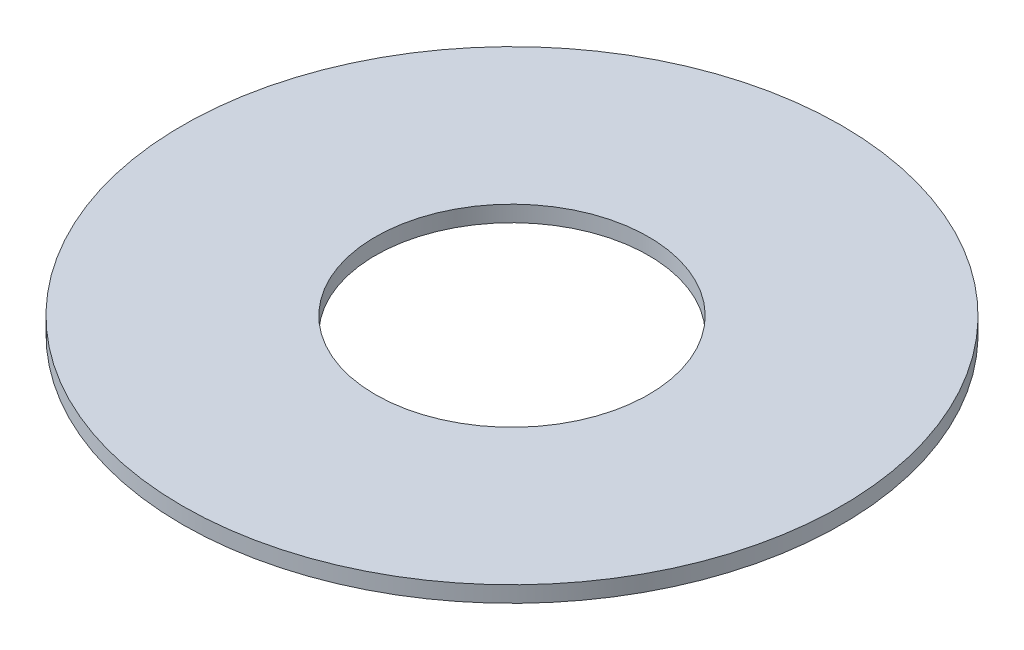
ISO-10303-21;
HEADER;
FILE_DESCRIPTION(('STEP AP214'),'2;1');
FILE_NAME('part.step','',(''),(''),'','','');
FILE_SCHEMA(('AUTOMOTIVE_DESIGN { 1 0 10303 214 1 1 1 1 }'));
ENDSEC;
DATA;
#1=APPLICATION_CONTEXT('core data for automotive mechanical design processes');
#2=APPLICATION_PROTOCOL_DEFINITION('international standard','automotive_design',2000,#1);
#3=PRODUCT_CONTEXT('',#1,'mechanical');
#4=PRODUCT('Part','Part','',(#3));
#5=PRODUCT_RELATED_PRODUCT_CATEGORY('part','',(#4));
#6=PRODUCT_DEFINITION_FORMATION('','',#4);
#7=PRODUCT_DEFINITION_CONTEXT('part definition',#1,'design');
#8=PRODUCT_DEFINITION('design','',#6,#7);
#9=PRODUCT_DEFINITION_SHAPE('','',#8);
#10=(LENGTH_UNIT() NAMED_UNIT(*) SI_UNIT(.MILLI.,.METRE.));
#11=(NAMED_UNIT(*) PLANE_ANGLE_UNIT() SI_UNIT($,.RADIAN.));
#12=(NAMED_UNIT(*) SI_UNIT($,.STERADIAN.) SOLID_ANGLE_UNIT());
#13=UNCERTAINTY_MEASURE_WITH_UNIT(LENGTH_MEASURE(1.E-05),#10,'distance_accuracy_value','');
#14=(GEOMETRIC_REPRESENTATION_CONTEXT(3) GLOBAL_UNCERTAINTY_ASSIGNED_CONTEXT((#13)) GLOBAL_UNIT_ASSIGNED_CONTEXT((#10,
#11,#12)) REPRESENTATION_CONTEXT('',''));
#15=CARTESIAN_POINT('',(0.,0.,0.));
#16=DIRECTION('',(0.,0.,1.));
#17=DIRECTION('',(1.,0.,0.));
#18=AXIS2_PLACEMENT_3D('',#15,#16,#17);
#19=CARTESIAN_POINT('',(0.,2.,0.));
#20=DIRECTION('',(0.,1.,0.));
#21=DIRECTION('',(0.,0.,1.));
#22=AXIS2_PLACEMENT_3D('',#19,#20,#21);
#23=PLANE('',#22);
#24=CARTESIAN_POINT('',(0.,2.,0.));
#25=DIRECTION('',(0.,1.,0.));
#26=DIRECTION('',(0.,0.,1.));
#27=AXIS2_PLACEMENT_3D('',#24,#25,#26);
#28=CIRCLE('',#27,41.);
#29=CARTESIAN_POINT('',(0.,2.,41.));
#30=VERTEX_POINT('',#29);
#31=EDGE_CURVE('E10',#30,#30,#28,.T.);
#32=ORIENTED_EDGE('',*,*,#31,.T.);
#33=EDGE_LOOP('',(#32));
#34=FACE_BOUND('',#33,.T.);
#35=CARTESIAN_POINT('',(0.,2.,0.));
#36=DIRECTION('',(0.,1.,0.));
#37=DIRECTION('',(0.,0.,1.));
#38=AXIS2_PLACEMENT_3D('',#35,#36,#37);
#39=CIRCLE('',#38,17.);
#40=CARTESIAN_POINT('',(0.,2.,17.));
#41=VERTEX_POINT('',#40);
#42=EDGE_CURVE('E42',#41,#41,#39,.T.);
#43=ORIENTED_EDGE('',*,*,#42,.F.);
#44=EDGE_LOOP('',(#43));
#45=FACE_BOUND('',#44,.T.);
#46=ADVANCED_FACE('F31',(#34,#45),#23,.T.);
#47=CARTESIAN_POINT('',(0.,0.,0.));
#48=DIRECTION('',(0.,1.,0.));
#49=DIRECTION('',(0.,0.,1.));
#50=AXIS2_PLACEMENT_3D('',#47,#48,#49);
#51=PLANE('',#50);
#52=CARTESIAN_POINT('',(0.,0.,0.));
#53=DIRECTION('',(0.,1.,0.));
#54=DIRECTION('',(0.,0.,1.));
#55=AXIS2_PLACEMENT_3D('',#52,#53,#54);
#56=CIRCLE('',#55,41.);
#57=CARTESIAN_POINT('',(0.,0.,41.));
#58=VERTEX_POINT('',#57);
#59=EDGE_CURVE('E35',#58,#58,#56,.T.);
#60=ORIENTED_EDGE('',*,*,#59,.F.);
#61=EDGE_LOOP('',(#60));
#62=FACE_BOUND('',#61,.T.);
#63=CARTESIAN_POINT('',(0.,0.,0.));
#64=DIRECTION('',(0.,1.,0.));
#65=DIRECTION('',(0.,0.,1.));
#66=AXIS2_PLACEMENT_3D('',#63,#64,#65);
#67=CIRCLE('',#66,17.);
#68=CARTESIAN_POINT('',(0.,0.,17.));
#69=VERTEX_POINT('',#68);
#70=EDGE_CURVE('E44',#69,#69,#67,.T.);
#71=ORIENTED_EDGE('',*,*,#70,.T.);
#72=EDGE_LOOP('',(#71));
#73=FACE_BOUND('',#72,.T.);
#74=ADVANCED_FACE('F54',(#62,#73),#51,.F.);
#75=CARTESIAN_POINT('',(0.,2.,0.));
#76=DIRECTION('',(0.,-1.,0.));
#77=DIRECTION('',(0.,0.,-1.));
#78=AXIS2_PLACEMENT_3D('',#75,#76,#77);
#79=CYLINDRICAL_SURFACE('',#78,41.);
#80=ORIENTED_EDGE('',*,*,#31,.F.);
#81=EDGE_LOOP('',(#80));
#82=FACE_BOUND('',#81,.T.);
#83=ORIENTED_EDGE('',*,*,#59,.T.);
#84=EDGE_LOOP('',(#83));
#85=FACE_BOUND('',#84,.T.);
#86=ADVANCED_FACE('F33',(#82,#85),#79,.T.);
#87=CARTESIAN_POINT('',(0.,2.,0.));
#88=DIRECTION('',(0.,-1.,0.));
#89=DIRECTION('',(0.,0.,-1.));
#90=AXIS2_PLACEMENT_3D('',#87,#88,#89);
#91=CYLINDRICAL_SURFACE('',#90,17.);
#92=ORIENTED_EDGE('',*,*,#42,.T.);
#93=EDGE_LOOP('',(#92));
#94=FACE_BOUND('',#93,.T.);
#95=ORIENTED_EDGE('',*,*,#70,.F.);
#96=EDGE_LOOP('',(#95));
#97=FACE_BOUND('',#96,.T.);
#98=ADVANCED_FACE('F50',(#94,#97),#91,.F.);
#99=CLOSED_SHELL('',(#46,#74,#86,#98));
#100=MANIFOLD_SOLID_BREP('B2',#99);
#101=ADVANCED_BREP_SHAPE_REPRESENTATION('',(#18,#100),#14);
#102=SHAPE_DEFINITION_REPRESENTATION(#9,#101);
ENDSEC;
END-ISO-10303-21;
